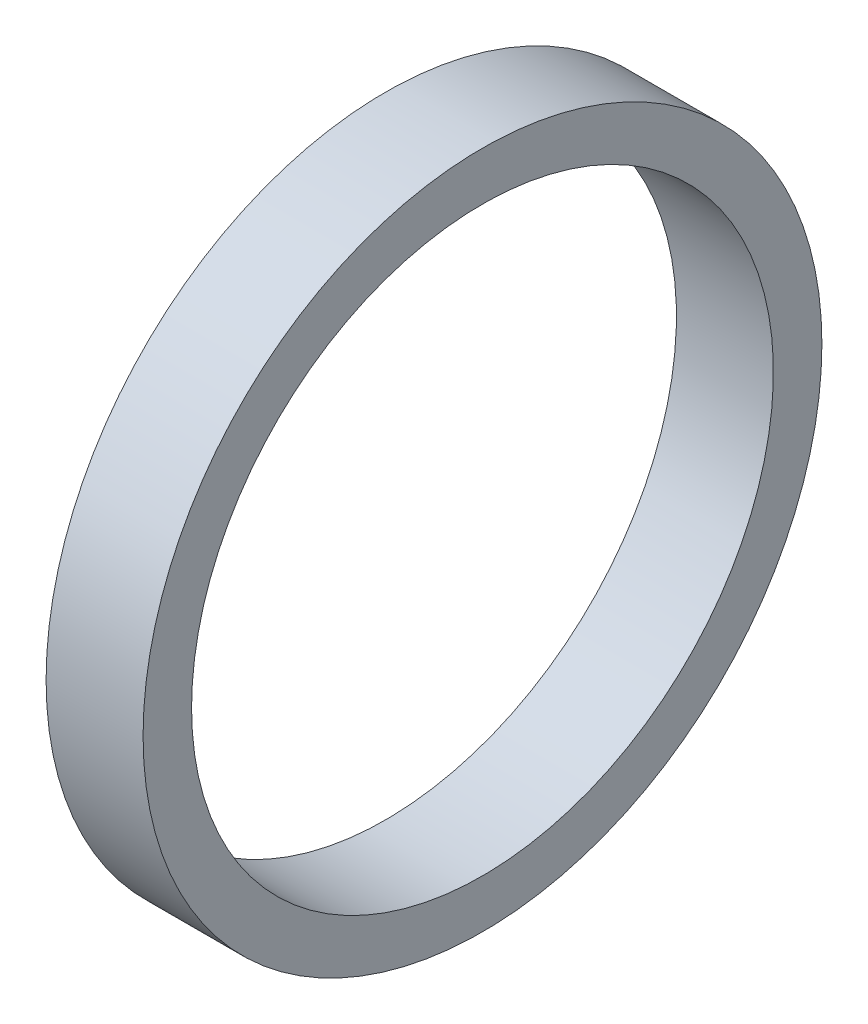
ISO-10303-21;
HEADER;
FILE_DESCRIPTION(('STEP AP214'),'2;1');
FILE_NAME('part.step','',(''),(''),'','','');
FILE_SCHEMA(('AUTOMOTIVE_DESIGN { 1 0 10303 214 1 1 1 1 }'));
ENDSEC;
DATA;
#1=APPLICATION_CONTEXT('core data for automotive mechanical design processes');
#2=APPLICATION_PROTOCOL_DEFINITION('international standard','automotive_design',2000,#1);
#3=PRODUCT_CONTEXT('',#1,'mechanical');
#4=PRODUCT('Part','Part','',(#3));
#5=PRODUCT_RELATED_PRODUCT_CATEGORY('part','',(#4));
#6=PRODUCT_DEFINITION_FORMATION('','',#4);
#7=PRODUCT_DEFINITION_CONTEXT('part definition',#1,'design');
#8=PRODUCT_DEFINITION('design','',#6,#7);
#9=PRODUCT_DEFINITION_SHAPE('','',#8);
#10=(LENGTH_UNIT() NAMED_UNIT(*) SI_UNIT(.MILLI.,.METRE.));
#11=(NAMED_UNIT(*) PLANE_ANGLE_UNIT() SI_UNIT($,.RADIAN.));
#12=(NAMED_UNIT(*) SI_UNIT($,.STERADIAN.) SOLID_ANGLE_UNIT());
#13=UNCERTAINTY_MEASURE_WITH_UNIT(LENGTH_MEASURE(1.E-05),#10,'distance_accuracy_value','');
#14=(GEOMETRIC_REPRESENTATION_CONTEXT(3) GLOBAL_UNCERTAINTY_ASSIGNED_CONTEXT((#13)) GLOBAL_UNIT_ASSIGNED_CONTEXT((#10,
#11,#12)) REPRESENTATION_CONTEXT('',''));
#15=CARTESIAN_POINT('',(0.,0.,0.));
#16=DIRECTION('',(0.,0.,1.));
#17=DIRECTION('',(1.,0.,0.));
#18=AXIS2_PLACEMENT_3D('',#15,#16,#17);
#19=CARTESIAN_POINT('',(0.,7.,0.));
#20=DIRECTION('',(1.,0.,0.));
#21=DIRECTION('',(0.,0.,-1.));
#22=AXIS2_PLACEMENT_3D('',#19,#20,#21);
#23=PLANE('',#22);
#24=CARTESIAN_POINT('',(0.,0.,0.));
#25=DIRECTION('',(-1.,0.,0.));
#26=DIRECTION('',(0.,0.,1.));
#27=AXIS2_PLACEMENT_3D('',#24,#25,#26);
#28=CIRCLE('',#27,6.);
#29=CARTESIAN_POINT('',(0.,0.,6.));
#30=VERTEX_POINT('',#29);
#31=EDGE_CURVE('E10',#30,#30,#28,.T.);
#32=ORIENTED_EDGE('',*,*,#31,.F.);
#33=EDGE_LOOP('',(#32));
#34=FACE_BOUND('',#33,.T.);
#35=CARTESIAN_POINT('',(0.,0.,0.));
#36=DIRECTION('',(-1.,0.,0.));
#37=DIRECTION('',(0.,0.,1.));
#38=AXIS2_PLACEMENT_3D('',#35,#36,#37);
#39=CIRCLE('',#38,7.);
#40=CARTESIAN_POINT('',(0.,0.,7.));
#41=VERTEX_POINT('',#40);
#42=EDGE_CURVE('E55',#41,#41,#39,.T.);
#43=ORIENTED_EDGE('',*,*,#42,.T.);
#44=EDGE_LOOP('',(#43));
#45=FACE_BOUND('',#44,.T.);
#46=ADVANCED_FACE('F41',(#34,#45),#23,.F.);
#47=CARTESIAN_POINT('',(0.,0.,0.));
#48=DIRECTION('',(-1.,0.,0.));
#49=DIRECTION('',(0.,0.,1.));
#50=AXIS2_PLACEMENT_3D('',#47,#48,#49);
#51=CYLINDRICAL_SURFACE('',#50,6.);
#52=CARTESIAN_POINT('',(2.,0.,0.));
#53=DIRECTION('',(-1.,0.,0.));
#54=DIRECTION('',(0.,0.,1.));
#55=AXIS2_PLACEMENT_3D('',#52,#53,#54);
#56=CIRCLE('',#55,6.);
#57=CARTESIAN_POINT('',(2.,0.,6.));
#58=VERTEX_POINT('',#57);
#59=EDGE_CURVE('E47',#58,#58,#56,.T.);
#60=ORIENTED_EDGE('',*,*,#59,.F.);
#61=EDGE_LOOP('',(#60));
#62=FACE_BOUND('',#61,.T.);
#63=ORIENTED_EDGE('',*,*,#31,.T.);
#64=EDGE_LOOP('',(#63));
#65=FACE_BOUND('',#64,.T.);
#66=ADVANCED_FACE('F70',(#62,#65),#51,.F.);
#67=CARTESIAN_POINT('',(2.,6.,0.));
#68=DIRECTION('',(-1.,0.,0.));
#69=DIRECTION('',(0.,0.,1.));
#70=AXIS2_PLACEMENT_3D('',#67,#68,#69);
#71=PLANE('',#70);
#72=CARTESIAN_POINT('',(2.,0.,0.));
#73=DIRECTION('',(-1.,0.,0.));
#74=DIRECTION('',(0.,0.,1.));
#75=AXIS2_PLACEMENT_3D('',#72,#73,#74);
#76=CIRCLE('',#75,7.);
#77=CARTESIAN_POINT('',(2.,0.,7.));
#78=VERTEX_POINT('',#77);
#79=EDGE_CURVE('E51',#78,#78,#76,.T.);
#80=ORIENTED_EDGE('',*,*,#79,.F.);
#81=EDGE_LOOP('',(#80));
#82=FACE_BOUND('',#81,.T.);
#83=ORIENTED_EDGE('',*,*,#59,.T.);
#84=EDGE_LOOP('',(#83));
#85=FACE_BOUND('',#84,.T.);
#86=ADVANCED_FACE('F65',(#82,#85),#71,.F.);
#87=CARTESIAN_POINT('',(0.,0.,0.));
#88=DIRECTION('',(-1.,0.,0.));
#89=DIRECTION('',(0.,0.,1.));
#90=AXIS2_PLACEMENT_3D('',#87,#88,#89);
#91=CYLINDRICAL_SURFACE('',#90,7.);
#92=ORIENTED_EDGE('',*,*,#42,.F.);
#93=EDGE_LOOP('',(#92));
#94=FACE_BOUND('',#93,.T.);
#95=ORIENTED_EDGE('',*,*,#79,.T.);
#96=EDGE_LOOP('',(#95));
#97=FACE_BOUND('',#96,.T.);
#98=ADVANCED_FACE('F62',(#94,#97),#91,.T.);
#99=CLOSED_SHELL('',(#46,#66,#86,#98));
#100=MANIFOLD_SOLID_BREP('B2',#99);
#101=ADVANCED_BREP_SHAPE_REPRESENTATION('',(#18,#100),#14);
#102=SHAPE_DEFINITION_REPRESENTATION(#9,#101);
ENDSEC;
END-ISO-10303-21;
